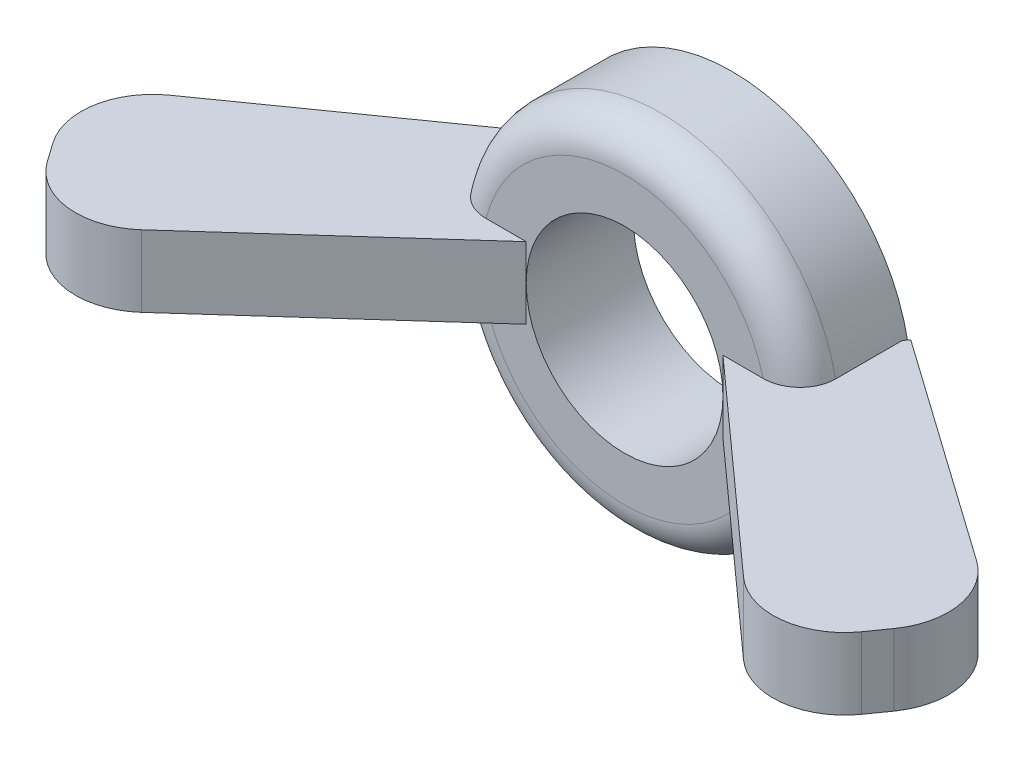
ISO-10303-21;
HEADER;
FILE_DESCRIPTION(('STEP AP214'),'2;1');
FILE_NAME('part.step','',(''),(''),'','','');
FILE_SCHEMA(('AUTOMOTIVE_DESIGN { 1 0 10303 214 1 1 1 1 }'));
ENDSEC;
DATA;
#1=APPLICATION_CONTEXT('core data for automotive mechanical design processes');
#2=APPLICATION_PROTOCOL_DEFINITION('international standard','automotive_design',2000,#1);
#3=PRODUCT_CONTEXT('',#1,'mechanical');
#4=PRODUCT('Part','Part','',(#3));
#5=PRODUCT_RELATED_PRODUCT_CATEGORY('part','',(#4));
#6=PRODUCT_DEFINITION_FORMATION('','',#4);
#7=PRODUCT_DEFINITION_CONTEXT('part definition',#1,'design');
#8=PRODUCT_DEFINITION('design','',#6,#7);
#9=PRODUCT_DEFINITION_SHAPE('','',#8);
#10=(LENGTH_UNIT() NAMED_UNIT(*) SI_UNIT(.MILLI.,.METRE.));
#11=(NAMED_UNIT(*) PLANE_ANGLE_UNIT() SI_UNIT($,.RADIAN.));
#12=(NAMED_UNIT(*) SI_UNIT($,.STERADIAN.) SOLID_ANGLE_UNIT());
#13=UNCERTAINTY_MEASURE_WITH_UNIT(LENGTH_MEASURE(1.E-05),#10,'distance_accuracy_value','');
#14=(GEOMETRIC_REPRESENTATION_CONTEXT(3) GLOBAL_UNCERTAINTY_ASSIGNED_CONTEXT((#13)) GLOBAL_UNIT_ASSIGNED_CONTEXT((#10,
#11,#12)) REPRESENTATION_CONTEXT('',''));
#15=CARTESIAN_POINT('',(0.,0.,0.));
#16=DIRECTION('',(0.,0.,1.));
#17=DIRECTION('',(1.,0.,0.));
#18=AXIS2_PLACEMENT_3D('',#15,#16,#17);
#19=CARTESIAN_POINT('',(0.,0.,3.));
#20=DIRECTION('',(0.,0.,1.));
#21=DIRECTION('',(1.,0.,0.));
#22=AXIS2_PLACEMENT_3D('',#19,#20,#21);
#23=PLANE('',#22);
#24=DIRECTION('',(-1.,0.,0.));
#25=VECTOR('',#24,1.);
#26=CARTESIAN_POINT('',(0.,-1.,3.));
#27=LINE('',#26,#25);
#28=CARTESIAN_POINT('',(-2.75,-1.,3.));
#29=VERTEX_POINT('',#28);
#30=CARTESIAN_POINT('',(-3.87298334620742,-1.,3.));
#31=VERTEX_POINT('',#30);
#32=EDGE_CURVE('E302',#29,#31,#27,.T.);
#33=ORIENTED_EDGE('',*,*,#32,.T.);
#34=CARTESIAN_POINT('',(0.,0.,3.));
#35=DIRECTION('',(0.,0.,1.));
#36=DIRECTION('',(1.,0.,0.));
#37=AXIS2_PLACEMENT_3D('',#34,#35,#36);
#38=CIRCLE('',#37,4.);
#39=CARTESIAN_POINT('',(3.87298334620742,-1.,3.));
#40=VERTEX_POINT('',#39);
#41=EDGE_CURVE('E331',#31,#40,#38,.T.);
#42=ORIENTED_EDGE('',*,*,#41,.T.);
#43=DIRECTION('',(1.,0.,0.));
#44=VECTOR('',#43,1.);
#45=CARTESIAN_POINT('',(0.,-1.,3.));
#46=LINE('',#45,#44);
#47=CARTESIAN_POINT('',(2.75,-1.,3.));
#48=VERTEX_POINT('',#47);
#49=EDGE_CURVE('E243',#48,#40,#46,.T.);
#50=ORIENTED_EDGE('',*,*,#49,.F.);
#51=DIRECTION('',(0.,1.,0.));
#52=VECTOR('',#51,1.);
#53=CARTESIAN_POINT('',(2.75,-1.,3.));
#54=LINE('',#53,#52);
#55=CARTESIAN_POINT('',(2.75,0.,3.));
#56=VERTEX_POINT('',#55);
#57=EDGE_CURVE('E228',#48,#56,#54,.T.);
#58=ORIENTED_EDGE('',*,*,#57,.T.);
#59=CARTESIAN_POINT('',(0.,0.,3.));
#60=DIRECTION('',(0.,0.,1.));
#61=DIRECTION('',(1.,0.,0.));
#62=AXIS2_PLACEMENT_3D('',#59,#60,#61);
#63=CIRCLE('',#62,2.75);
#64=CARTESIAN_POINT('',(-2.75,0.,3.));
#65=VERTEX_POINT('',#64);
#66=EDGE_CURVE('E306',#65,#56,#63,.T.);
#67=ORIENTED_EDGE('',*,*,#66,.F.);
#68=DIRECTION('',(0.,1.,0.));
#69=VECTOR('',#68,1.);
#70=CARTESIAN_POINT('',(-2.75,-1.,3.));
#71=LINE('',#70,#69);
#72=EDGE_CURVE('E280',#29,#65,#71,.T.);
#73=ORIENTED_EDGE('',*,*,#72,.F.);
#74=EDGE_LOOP('',(#33,#42,#50,#58,#67,#73));
#75=FACE_BOUND('',#74,.T.);
#76=ADVANCED_FACE('F33',(#75),#23,.T.);
#77=CARTESIAN_POINT('',(0.,0.,3.));
#78=DIRECTION('',(0.,0.,-1.));
#79=DIRECTION('',(-1.,0.,0.));
#80=AXIS2_PLACEMENT_3D('',#77,#78,#79);
#81=CYLINDRICAL_SURFACE('',#80,5.);
#82=DIRECTION('',(0.,0.,-1.));
#83=VECTOR('',#82,1.);
#84=CARTESIAN_POINT('',(4.89897948556636,-1.,3.));
#85=LINE('',#84,#83);
#86=CARTESIAN_POINT('',(4.89897948556635,-1.,0.13469401924486));
#87=VERTEX_POINT('',#86);
#88=CARTESIAN_POINT('',(4.89897948556636,-1.,2.));
#89=VERTEX_POINT('',#88);
#90=EDGE_CURVE('E324',#87,#89,#85,.F.);
#91=ORIENTED_EDGE('',*,*,#90,.T.);
#92=CARTESIAN_POINT('',(0.,0.,2.));
#93=DIRECTION('',(0.,0.,1.));
#94=DIRECTION('',(1.,0.,0.));
#95=AXIS2_PLACEMENT_3D('',#92,#93,#94);
#96=CIRCLE('',#95,5.);
#97=CARTESIAN_POINT('',(-4.89897948556636,-1.,2.));
#98=VERTEX_POINT('',#97);
#99=EDGE_CURVE('E53',#89,#98,#96,.F.);
#100=ORIENTED_EDGE('',*,*,#99,.T.);
#101=DIRECTION('',(0.,0.,-1.));
#102=VECTOR('',#101,1.);
#103=CARTESIAN_POINT('',(-4.89897948556636,-1.,3.));
#104=LINE('',#103,#102);
#105=CARTESIAN_POINT('',(-4.89897948556636,-1.,0.134694019244858));
#106=VERTEX_POINT('',#105);
#107=EDGE_CURVE('E319',#106,#98,#104,.F.);
#108=ORIENTED_EDGE('',*,*,#107,.F.);
#109=CARTESIAN_POINT('',(0.,0.,6.66666666666667));
#110=DIRECTION('',(0.8,0.,-0.6));
#111=DIRECTION('',(-0.6,0.,-0.8));
#112=AXIS2_PLACEMENT_3D('',#109,#110,#111);
#113=ELLIPSE('',#112,8.33333333333333,5.);
#114=CARTESIAN_POINT('',(-5.,0.,0.));
#115=VERTEX_POINT('',#114);
#116=EDGE_CURVE('E283',#106,#115,#113,.T.);
#117=ORIENTED_EDGE('',*,*,#116,.T.);
#118=CARTESIAN_POINT('',(0.,0.,0.));
#119=DIRECTION('',(0.,0.,1.));
#120=DIRECTION('',(1.,0.,0.));
#121=AXIS2_PLACEMENT_3D('',#118,#119,#120);
#122=CIRCLE('',#121,5.);
#123=CARTESIAN_POINT('',(5.,0.,0.));
#124=VERTEX_POINT('',#123);
#125=EDGE_CURVE('E313',#115,#124,#122,.T.);
#126=ORIENTED_EDGE('',*,*,#125,.T.);
#127=CARTESIAN_POINT('',(0.,0.,6.66666666666667));
#128=DIRECTION('',(-0.8,0.,-0.6));
#129=DIRECTION('',(0.6,0.,-0.8));
#130=AXIS2_PLACEMENT_3D('',#127,#128,#129);
#131=ELLIPSE('',#130,8.33333333333333,5.);
#132=EDGE_CURVE('E239',#124,#87,#131,.T.);
#133=ORIENTED_EDGE('',*,*,#132,.T.);
#134=EDGE_LOOP('',(#91,#100,#108,#117,#126,#133));
#135=FACE_BOUND('',#134,.T.);
#136=ADVANCED_FACE('F395',(#135),#81,.T.);
#137=DIRECTION('',(1.,0.,0.));
#138=VECTOR('',#137,1.);
#139=CARTESIAN_POINT('',(0.,1.,3.));
#140=LINE('',#139,#138);
#141=CARTESIAN_POINT('',(2.75,1.,3.));
#142=VERTEX_POINT('',#141);
#143=CARTESIAN_POINT('',(3.87298334620742,1.,3.));
#144=VERTEX_POINT('',#143);
#145=EDGE_CURVE('E240',#142,#144,#140,.T.);
#146=ORIENTED_EDGE('',*,*,#145,.T.);
#147=CARTESIAN_POINT('',(0.,0.,3.));
#148=DIRECTION('',(0.,0.,1.));
#149=DIRECTION('',(1.,0.,0.));
#150=AXIS2_PLACEMENT_3D('',#147,#148,#149);
#151=CIRCLE('',#150,4.);
#152=CARTESIAN_POINT('',(-3.87298334620742,1.,3.));
#153=VERTEX_POINT('',#152);
#154=EDGE_CURVE('E326',#144,#153,#151,.T.);
#155=ORIENTED_EDGE('',*,*,#154,.T.);
#156=DIRECTION('',(-1.,0.,0.));
#157=VECTOR('',#156,1.);
#158=CARTESIAN_POINT('',(0.,1.,3.));
#159=LINE('',#158,#157);
#160=CARTESIAN_POINT('',(-2.75,1.,3.));
#161=VERTEX_POINT('',#160);
#162=EDGE_CURVE('E299',#161,#153,#159,.T.);
#163=ORIENTED_EDGE('',*,*,#162,.F.);
#164=EDGE_CURVE('E284',#65,#161,#71,.T.);
#165=ORIENTED_EDGE('',*,*,#164,.F.);
#166=EDGE_CURVE('E310',#56,#65,#63,.T.);
#167=ORIENTED_EDGE('',*,*,#166,.F.);
#168=EDGE_CURVE('E230',#56,#142,#54,.T.);
#169=ORIENTED_EDGE('',*,*,#168,.T.);
#170=EDGE_LOOP('',(#146,#155,#163,#165,#167,#169));
#171=FACE_BOUND('',#170,.T.);
#172=ADVANCED_FACE('F391',(#171),#23,.T.);
#173=DIRECTION('',(0.,0.,-1.));
#174=VECTOR('',#173,1.);
#175=CARTESIAN_POINT('',(-4.89897948556636,1.,3.));
#176=LINE('',#175,#174);
#177=CARTESIAN_POINT('',(-4.89897948556636,1.,0.134694019244858));
#178=VERTEX_POINT('',#177);
#179=CARTESIAN_POINT('',(-4.89897948556636,1.,2.));
#180=VERTEX_POINT('',#179);
#181=EDGE_CURVE('E316',#178,#180,#176,.F.);
#182=ORIENTED_EDGE('',*,*,#181,.T.);
#183=CARTESIAN_POINT('',(0.,0.,2.));
#184=DIRECTION('',(0.,0.,1.));
#185=DIRECTION('',(1.,0.,0.));
#186=AXIS2_PLACEMENT_3D('',#183,#184,#185);
#187=CIRCLE('',#186,5.);
#188=CARTESIAN_POINT('',(4.89897948556636,1.,2.));
#189=VERTEX_POINT('',#188);
#190=EDGE_CURVE('E329',#180,#189,#187,.F.);
#191=ORIENTED_EDGE('',*,*,#190,.T.);
#192=DIRECTION('',(0.,0.,-1.));
#193=VECTOR('',#192,1.);
#194=CARTESIAN_POINT('',(4.89897948556636,1.,3.));
#195=LINE('',#194,#193);
#196=CARTESIAN_POINT('',(4.89897948556636,1.,0.134694019244858));
#197=VERTEX_POINT('',#196);
#198=EDGE_CURVE('E321',#197,#189,#195,.F.);
#199=ORIENTED_EDGE('',*,*,#198,.F.);
#200=EDGE_CURVE('E227',#197,#124,#131,.T.);
#201=ORIENTED_EDGE('',*,*,#200,.T.);
#202=EDGE_CURVE('E309',#124,#115,#122,.T.);
#203=ORIENTED_EDGE('',*,*,#202,.T.);
#204=EDGE_CURVE('E298',#115,#178,#113,.T.);
#205=ORIENTED_EDGE('',*,*,#204,.T.);
#206=EDGE_LOOP('',(#182,#191,#199,#201,#203,#205));
#207=FACE_BOUND('',#206,.T.);
#208=ADVANCED_FACE('F394',(#207),#81,.T.);
#209=CARTESIAN_POINT('',(0.,0.,0.));
#210=DIRECTION('',(0.,0.,1.));
#211=DIRECTION('',(1.,0.,0.));
#212=AXIS2_PLACEMENT_3D('',#209,#210,#211);
#213=PLANE('',#212);
#214=ORIENTED_EDGE('',*,*,#125,.F.);
#215=ORIENTED_EDGE('',*,*,#202,.F.);
#216=EDGE_LOOP('',(#214,#215));
#217=FACE_BOUND('',#216,.T.);
#218=CARTESIAN_POINT('',(0.,0.,0.));
#219=DIRECTION('',(0.,0.,1.));
#220=DIRECTION('',(1.,0.,0.));
#221=AXIS2_PLACEMENT_3D('',#218,#219,#220);
#222=CIRCLE('',#221,2.75);
#223=CARTESIAN_POINT('',(2.75,0.,0.));
#224=VERTEX_POINT('',#223);
#225=EDGE_CURVE('E305',#224,#224,#222,.T.);
#226=ORIENTED_EDGE('',*,*,#225,.T.);
#227=EDGE_LOOP('',(#226));
#228=FACE_BOUND('',#227,.T.);
#229=ADVANCED_FACE('F389',(#217,#228),#213,.F.);
#230=CARTESIAN_POINT('',(0.,0.,3.));
#231=DIRECTION('',(0.,0.,-1.));
#232=DIRECTION('',(-1.,0.,0.));
#233=AXIS2_PLACEMENT_3D('',#230,#231,#232);
#234=CYLINDRICAL_SURFACE('',#233,2.75);
#235=ORIENTED_EDGE('',*,*,#66,.T.);
#236=ORIENTED_EDGE('',*,*,#166,.T.);
#237=EDGE_LOOP('',(#235,#236));
#238=FACE_BOUND('',#237,.T.);
#239=ORIENTED_EDGE('',*,*,#225,.F.);
#240=EDGE_LOOP('',(#239));
#241=FACE_BOUND('',#240,.T.);
#242=ADVANCED_FACE('F385',(#238,#241),#234,.F.);
#243=CARTESIAN_POINT('',(-5.,-1.,0.));
#244=DIRECTION('',(0.8,0.,-0.6));
#245=DIRECTION('',(-0.6,0.,-0.8));
#246=AXIS2_PLACEMENT_3D('',#243,#244,#245);
#247=PLANE('',#246);
#248=ORIENTED_EDGE('',*,*,#204,.F.);
#249=DIRECTION('',(0.,1.,0.));
#250=VECTOR('',#249,1.);
#251=CARTESIAN_POINT('',(-5.,-1.,0.));
#252=LINE('',#251,#250);
#253=CARTESIAN_POINT('',(-5.,1.,0.));
#254=VERTEX_POINT('',#253);
#255=EDGE_CURVE('E279',#115,#254,#252,.T.);
#256=ORIENTED_EDGE('',*,*,#255,.T.);
#257=DIRECTION('',(-0.6,0.,-0.8));
#258=VECTOR('',#257,1.);
#259=CARTESIAN_POINT('',(-5.,1.,0.));
#260=LINE('',#259,#258);
#261=EDGE_CURVE('E245',#178,#254,#260,.T.);
#262=ORIENTED_EDGE('',*,*,#261,.F.);
#263=EDGE_LOOP('',(#248,#256,#262));
#264=FACE_BOUND('',#263,.T.);
#265=ADVANCED_FACE('F382',(#264),#247,.T.);
#266=ORIENTED_EDGE('',*,*,#116,.F.);
#267=DIRECTION('',(-0.6,0.,-0.8));
#268=VECTOR('',#267,1.);
#269=CARTESIAN_POINT('',(-5.,-1.,0.));
#270=LINE('',#269,#268);
#271=CARTESIAN_POINT('',(-5.,-1.,0.));
#272=VERTEX_POINT('',#271);
#273=EDGE_CURVE('E262',#106,#272,#270,.T.);
#274=ORIENTED_EDGE('',*,*,#273,.T.);
#275=EDGE_CURVE('E293',#272,#115,#252,.T.);
#276=ORIENTED_EDGE('',*,*,#275,.T.);
#277=EDGE_LOOP('',(#266,#274,#276));
#278=FACE_BOUND('',#277,.T.);
#279=ADVANCED_FACE('F366',(#278),#247,.T.);
#280=CARTESIAN_POINT('',(-8.41291055013189,-1.,8.08746087611477));
#281=DIRECTION('',(0.668299770310106,0.,0.743892073491484));
#282=DIRECTION('',(0.743892073491484,0.,-0.668299770310106));
#283=AXIS2_PLACEMENT_3D('',#280,#281,#282);
#284=PLANE('',#283);
#285=ORIENTED_EDGE('',*,*,#72,.T.);
#286=ORIENTED_EDGE('',*,*,#164,.T.);
#287=DIRECTION('',(0.743892073491484,0.,-0.668299770310106));
#288=VECTOR('',#287,1.);
#289=CARTESIAN_POINT('',(-8.41291055013189,1.,8.08746087611477));
#290=LINE('',#289,#288);
#291=CARTESIAN_POINT('',(-8.41291055013189,1.,8.08746087611477));
#292=VERTEX_POINT('',#291);
#293=EDGE_CURVE('E259',#292,#161,#290,.T.);
#294=ORIENTED_EDGE('',*,*,#293,.F.);
#295=DIRECTION('',(0.,1.,0.));
#296=VECTOR('',#295,1.);
#297=CARTESIAN_POINT('',(-8.41291055013189,-1.,8.08746087611477));
#298=LINE('',#297,#296);
#299=CARTESIAN_POINT('',(-8.41291055013189,-1.,8.08746087611477));
#300=VERTEX_POINT('',#299);
#301=EDGE_CURVE('E285',#300,#292,#298,.T.);
#302=ORIENTED_EDGE('',*,*,#301,.F.);
#303=DIRECTION('',(0.743892073491484,0.,-0.668299770310106));
#304=VECTOR('',#303,1.);
#305=CARTESIAN_POINT('',(-8.41291055013189,-1.,8.08746087611477));
#306=LINE('',#305,#304);
#307=EDGE_CURVE('E276',#300,#29,#306,.T.);
#308=ORIENTED_EDGE('',*,*,#307,.T.);
#309=EDGE_LOOP('',(#285,#286,#294,#302,#308));
#310=FACE_BOUND('',#309,.T.);
#311=ADVANCED_FACE('F362',(#310),#284,.T.);
#312=CARTESIAN_POINT('',(-9.7495100907521,-1.,6.5996767291318));
#313=DIRECTION('',(0.,1.,0.));
#314=DIRECTION('',(0.,0.,1.));
#315=AXIS2_PLACEMENT_3D('',#312,#313,#314);
#316=CYLINDRICAL_SURFACE('',#315,2.);
#317=ORIENTED_EDGE('',*,*,#301,.T.);
#318=CARTESIAN_POINT('',(-9.7495100907521,1.,6.5996767291318));
#319=DIRECTION('',(0.,1.,0.));
#320=DIRECTION('',(0.,0.,1.));
#321=AXIS2_PLACEMENT_3D('',#318,#319,#320);
#322=CIRCLE('',#321,2.);
#323=CARTESIAN_POINT('',(-11.3829267537404,1.,7.75377811335772));
#324=VERTEX_POINT('',#323);
#325=EDGE_CURVE('E256',#324,#292,#322,.T.);
#326=ORIENTED_EDGE('',*,*,#325,.F.);
#327=DIRECTION('',(0.,1.,0.));
#328=VECTOR('',#327,1.);
#329=CARTESIAN_POINT('',(-11.3829267537404,-1.,7.75377811335772));
#330=LINE('',#329,#328);
#331=CARTESIAN_POINT('',(-11.3829267537404,-1.,7.75377811335772));
#332=VERTEX_POINT('',#331);
#333=EDGE_CURVE('E287',#332,#324,#330,.T.);
#334=ORIENTED_EDGE('',*,*,#333,.F.);
#335=CARTESIAN_POINT('',(-9.7495100907521,-1.,6.5996767291318));
#336=DIRECTION('',(0.,1.,0.));
#337=DIRECTION('',(0.,0.,1.));
#338=AXIS2_PLACEMENT_3D('',#335,#336,#337);
#339=CIRCLE('',#338,2.);
#340=EDGE_CURVE('E273',#332,#300,#339,.T.);
#341=ORIENTED_EDGE('',*,*,#340,.T.);
#342=EDGE_LOOP('',(#317,#326,#334,#341));
#343=FACE_BOUND('',#342,.T.);
#344=ADVANCED_FACE('F365',(#343),#316,.T.);
#345=CARTESIAN_POINT('',(-11.7576074327959,-1.,7.22348703769145));
#346=DIRECTION('',(-0.816708331494145,0.,0.577050692112963));
#347=DIRECTION('',(0.577050692112963,0.,0.816708331494145));
#348=AXIS2_PLACEMENT_3D('',#345,#346,#347);
#349=PLANE('',#348);
#350=ORIENTED_EDGE('',*,*,#333,.T.);
#351=DIRECTION('',(0.577050692112963,0.,0.816708331494145));
#352=VECTOR('',#351,1.);
#353=CARTESIAN_POINT('',(-11.7576074327959,1.,7.22348703769145));
#354=LINE('',#353,#352);
#355=CARTESIAN_POINT('',(-11.7576074327959,1.,7.22348703769145));
#356=VERTEX_POINT('',#355);
#357=EDGE_CURVE('E253',#356,#324,#354,.T.);
#358=ORIENTED_EDGE('',*,*,#357,.F.);
#359=DIRECTION('',(0.,1.,0.));
#360=VECTOR('',#359,1.);
#361=CARTESIAN_POINT('',(-11.7576074327959,-1.,7.22348703769145));
#362=LINE('',#361,#360);
#363=CARTESIAN_POINT('',(-11.7576074327959,-1.,7.22348703769145));
#364=VERTEX_POINT('',#363);
#365=EDGE_CURVE('E289',#364,#356,#362,.T.);
#366=ORIENTED_EDGE('',*,*,#365,.F.);
#367=DIRECTION('',(0.577050692112963,0.,0.816708331494145));
#368=VECTOR('',#367,1.);
#369=CARTESIAN_POINT('',(-11.7576074327959,-1.,7.22348703769145));
#370=LINE('',#369,#368);
#371=EDGE_CURVE('E270',#364,#332,#370,.T.);
#372=ORIENTED_EDGE('',*,*,#371,.T.);
#373=EDGE_LOOP('',(#350,#358,#366,#372));
#374=FACE_BOUND('',#373,.T.);
#375=ADVANCED_FACE('F370',(#374),#349,.T.);
#376=CARTESIAN_POINT('',(-10.1241907698076,-1.,6.06938565346553));
#377=DIRECTION('',(0.,1.,0.));
#378=DIRECTION('',(0.,0.,1.));
#379=AXIS2_PLACEMENT_3D('',#376,#377,#378);
#380=CYLINDRICAL_SURFACE('',#379,2.);
#381=ORIENTED_EDGE('',*,*,#365,.T.);
#382=CARTESIAN_POINT('',(-10.1241907698076,1.,6.06938565346553));
#383=DIRECTION('',(0.,1.,0.));
#384=DIRECTION('',(0.,0.,1.));
#385=AXIS2_PLACEMENT_3D('',#382,#383,#384);
#386=CIRCLE('',#385,2.);
#387=CARTESIAN_POINT('',(-11.2782921540336,1.,4.43596899047724));
#388=VERTEX_POINT('',#387);
#389=EDGE_CURVE('E250',#388,#356,#386,.T.);
#390=ORIENTED_EDGE('',*,*,#389,.F.);
#391=DIRECTION('',(0.,1.,0.));
#392=VECTOR('',#391,1.);
#393=CARTESIAN_POINT('',(-11.2782921540336,-1.,4.43596899047724));
#394=LINE('',#393,#392);
#395=CARTESIAN_POINT('',(-11.2782921540336,-1.,4.43596899047724));
#396=VERTEX_POINT('',#395);
#397=EDGE_CURVE('E291',#396,#388,#394,.T.);
#398=ORIENTED_EDGE('',*,*,#397,.F.);
#399=CARTESIAN_POINT('',(-10.1241907698076,-1.,6.06938565346553));
#400=DIRECTION('',(0.,1.,0.));
#401=DIRECTION('',(0.,0.,1.));
#402=AXIS2_PLACEMENT_3D('',#399,#400,#401);
#403=CIRCLE('',#402,2.);
#404=EDGE_CURVE('E267',#396,#364,#403,.T.);
#405=ORIENTED_EDGE('',*,*,#404,.T.);
#406=EDGE_LOOP('',(#381,#390,#398,#405));
#407=FACE_BOUND('',#406,.T.);
#408=ADVANCED_FACE('F374',(#407),#380,.T.);
#409=CARTESIAN_POINT('',(-5.,-1.,0.));
#410=DIRECTION('',(-0.577050692112961,0.,-0.816708331494147));
#411=DIRECTION('',(-0.816708331494147,0.,0.577050692112961));
#412=AXIS2_PLACEMENT_3D('',#409,#410,#411);
#413=PLANE('',#412);
#414=ORIENTED_EDGE('',*,*,#397,.T.);
#415=DIRECTION('',(-0.816708331494147,0.,0.577050692112961));
#416=VECTOR('',#415,1.);
#417=CARTESIAN_POINT('',(-5.,1.,0.));
#418=LINE('',#417,#416);
#419=EDGE_CURVE('E247',#254,#388,#418,.T.);
#420=ORIENTED_EDGE('',*,*,#419,.F.);
#421=ORIENTED_EDGE('',*,*,#255,.F.);
#422=ORIENTED_EDGE('',*,*,#275,.F.);
#423=DIRECTION('',(-0.816708331494147,0.,0.577050692112961));
#424=VECTOR('',#423,1.);
#425=CARTESIAN_POINT('',(-5.,-1.,0.));
#426=LINE('',#425,#424);
#427=EDGE_CURVE('E264',#272,#396,#426,.T.);
#428=ORIENTED_EDGE('',*,*,#427,.T.);
#429=EDGE_LOOP('',(#414,#420,#421,#422,#428));
#430=FACE_BOUND('',#429,.T.);
#431=ADVANCED_FACE('F360',(#430),#413,.T.);
#432=CARTESIAN_POINT('',(-9.7495100907521,-1.,6.5996767291318));
#433=DIRECTION('',(0.,1.,0.));
#434=DIRECTION('',(0.,0.,1.));
#435=AXIS2_PLACEMENT_3D('',#432,#433,#434);
#436=PLANE('',#435);
#437=ORIENTED_EDGE('',*,*,#32,.F.);
#438=ORIENTED_EDGE('',*,*,#307,.F.);
#439=ORIENTED_EDGE('',*,*,#340,.F.);
#440=ORIENTED_EDGE('',*,*,#371,.F.);
#441=ORIENTED_EDGE('',*,*,#404,.F.);
#442=ORIENTED_EDGE('',*,*,#427,.F.);
#443=ORIENTED_EDGE('',*,*,#273,.F.);
#444=ORIENTED_EDGE('',*,*,#107,.T.);
#445=CARTESIAN_POINT('',(-4.89897948556636,-1.,2.));
#446=CARTESIAN_POINT('',(-4.89897953769252,-1.,2.02769671046722));
#447=CARTESIAN_POINT('',(-4.89780433750787,-1.,2.05538003328283));
#448=CARTESIAN_POINT('',(-4.89311761693166,-1.,2.11054593320961));
#449=CARTESIAN_POINT('',(-4.88960628577636,-1.,2.13802852639842));
#450=CARTESIAN_POINT('',(-4.87560908157791,-1.,2.2198042007192));
#451=CARTESIAN_POINT('',(-4.86165985616151,-1.,2.2735451865649));
#452=CARTESIAN_POINT('',(-4.82495038442105,-1.,2.37791372215591));
#453=CARTESIAN_POINT('',(-4.80218733714401,-1.,2.42854027622993));
#454=CARTESIAN_POINT('',(-4.74854706497202,-1.,2.52529559316128));
#455=CARTESIAN_POINT('',(-4.71767015424067,-1.,2.57142453006868));
#456=CARTESIAN_POINT('',(-4.64846379058115,-1.,2.65827442333467));
#457=CARTESIAN_POINT('',(-4.61007951794842,-1.,2.6989516462707));
#458=CARTESIAN_POINT('',(-4.52713683011098,-1.,2.77343679547463));
#459=CARTESIAN_POINT('',(-4.48257729892751,-1.,2.80724347738404));
#460=CARTESIAN_POINT('',(-4.38764424072155,-1.,2.86774033938808));
#461=CARTESIAN_POINT('',(-4.33717448507534,-1.,2.89427930737229));
#462=CARTESIAN_POINT('',(-4.23257257993109,-1.,2.93873696583397));
#463=CARTESIAN_POINT('',(-4.17844089274068,-1.,2.95665674214998));
#464=CARTESIAN_POINT('',(-4.08228944581671,-1.,2.98004418450993));
#465=CARTESIAN_POINT('',(-4.04074746508235,-1.,2.98753156842478));
#466=CARTESIAN_POINT('',(-3.95713442986744,-1.,2.99750939937191));
#467=CARTESIAN_POINT('',(-3.91506432578064,-1.,3.00000780376358));
#468=CARTESIAN_POINT('',(-3.87298334620742,-1.,3.));
#469=B_SPLINE_CURVE_WITH_KNOTS('',3,(#445,#446,#447,#448,#449,#450,#451,#452,#453,#454,#455,
#456,#457,#458,#459,#460,#461,#462,#463,#464,#465,#466,#467,#468),.UNSPECIFIED.,.F.,.F.,(4,2,2,
2,2,2,2,2,2,2,2,4),(0.,0.0830386808123157,0.166070635967418,0.331779135941515,0.4975403398586,
0.663295126553686,0.830308791210176,0.997352677652824,1.16764570632508,1.3379172760016,
1.46426486625696,1.59041077221889),.UNSPECIFIED.);
#470=EDGE_CURVE('E11',#98,#31,#469,.T.);
#471=ORIENTED_EDGE('',*,*,#470,.T.);
#472=EDGE_LOOP('',(#437,#438,#439,#440,#441,#442,#443,#444,#471));
#473=FACE_BOUND('',#472,.T.);
#474=ADVANCED_FACE('F354',(#473),#436,.F.);
#475=CARTESIAN_POINT('',(-9.7495100907521,1.,6.5996767291318));
#476=DIRECTION('',(0.,1.,0.));
#477=DIRECTION('',(0.,0.,1.));
#478=AXIS2_PLACEMENT_3D('',#475,#476,#477);
#479=PLANE('',#478);
#480=ORIENTED_EDGE('',*,*,#293,.T.);
#481=ORIENTED_EDGE('',*,*,#162,.T.);
#482=CARTESIAN_POINT('',(-3.87298334620742,1.,3.));
#483=CARTESIAN_POINT('',(-3.90248046424841,1.,2.9999994274582));
#484=CARTESIAN_POINT('',(-3.93196440432356,1.,2.99877566262111));
#485=CARTESIAN_POINT('',(-3.99073029101351,1.,2.99388044653298));
#486=CARTESIAN_POINT('',(-4.02001222299989,1.,2.99020881986111));
#487=CARTESIAN_POINT('',(-4.10725065429741,1.,2.97552626350704));
#488=CARTESIAN_POINT('',(-4.16463519401809,1.,2.96084765796537));
#489=CARTESIAN_POINT('',(-4.27613653028676,1.,2.92198926371139));
#490=CARTESIAN_POINT('',(-4.33024977421371,1.,2.89779935225144));
#491=CARTESIAN_POINT('',(-4.43351548278463,1.,2.84050968568627));
#492=CARTESIAN_POINT('',(-4.48267065475829,1.,2.80741482968905));
#493=CARTESIAN_POINT('',(-4.57360186677932,1.,2.73391226460698));
#494=CARTESIAN_POINT('',(-4.61550221619383,1.,2.69365833768063));
#495=CARTESIAN_POINT('',(-4.69175485394343,1.,2.60651728967209));
#496=CARTESIAN_POINT('',(-4.72610583481488,1.,2.55962902190629));
#497=CARTESIAN_POINT('',(-4.78539895911501,1.,2.46179838009332));
#498=CARTESIAN_POINT('',(-4.81054873902346,1.,2.41098162398401));
#499=CARTESIAN_POINT('',(-4.85177069043608,1.,2.30581322741058));
#500=CARTESIAN_POINT('',(-4.86785111158046,1.,2.25146484972584));
#501=CARTESIAN_POINT('',(-4.88573983881054,1.,2.16389806882584));
#502=CARTESIAN_POINT('',(-4.89070243324983,1.,2.13129226806736));
#503=CARTESIAN_POINT('',(-4.89732095042909,1.,2.06579613663552));
#504=CARTESIAN_POINT('',(-4.89898180786745,1.,2.03290630447792));
#505=CARTESIAN_POINT('',(-4.89897948556636,1.,2.));
#506=B_SPLINE_CURVE_WITH_KNOTS('',3,(#482,#483,#484,#485,#486,#487,#488,#489,#490,#491,#492,
#493,#494,#495,#496,#497,#498,#499,#500,#501,#502,#503,#504,#505),.UNSPECIFIED.,.F.,.F.,(4,2,2,
2,2,2,2,2,2,2,2,4),(0.,0.0884392063282547,0.176884751146111,0.353670951622964,0.530645814648994,
0.707523512277266,0.880980952542802,1.05446841000635,1.22375612891884,1.39288961151274,
1.49168211385747,1.59032685191303),.UNSPECIFIED.);
#507=EDGE_CURVE('E335',#153,#180,#506,.T.);
#508=ORIENTED_EDGE('',*,*,#507,.T.);
#509=ORIENTED_EDGE('',*,*,#181,.F.);
#510=ORIENTED_EDGE('',*,*,#261,.T.);
#511=ORIENTED_EDGE('',*,*,#419,.T.);
#512=ORIENTED_EDGE('',*,*,#389,.T.);
#513=ORIENTED_EDGE('',*,*,#357,.T.);
#514=ORIENTED_EDGE('',*,*,#325,.T.);
#515=EDGE_LOOP('',(#480,#481,#508,#509,#510,#511,#512,#513,#514));
#516=FACE_BOUND('',#515,.T.);
#517=ADVANCED_FACE('F349',(#516),#479,.T.);
#518=CARTESIAN_POINT('',(5.,-1.,0.));
#519=DIRECTION('',(-0.8,0.,-0.6));
#520=DIRECTION('',(-0.6,0.,0.8));
#521=AXIS2_PLACEMENT_3D('',#518,#519,#520);
#522=PLANE('',#521);
#523=ORIENTED_EDGE('',*,*,#132,.F.);
#524=DIRECTION('',(0.,1.,0.));
#525=VECTOR('',#524,1.);
#526=CARTESIAN_POINT('',(5.,-1.,0.));
#527=LINE('',#526,#525);
#528=CARTESIAN_POINT('',(5.,-1.,0.));
#529=VERTEX_POINT('',#528);
#530=EDGE_CURVE('E231',#529,#124,#527,.T.);
#531=ORIENTED_EDGE('',*,*,#530,.F.);
#532=DIRECTION('',(-0.6,0.,0.8));
#533=VECTOR('',#532,1.);
#534=CARTESIAN_POINT('',(5.,-1.,0.));
#535=LINE('',#534,#533);
#536=EDGE_CURVE('E220',#529,#87,#535,.T.);
#537=ORIENTED_EDGE('',*,*,#536,.T.);
#538=EDGE_LOOP('',(#523,#531,#537));
#539=FACE_BOUND('',#538,.T.);
#540=ADVANCED_FACE('F353',(#539),#522,.T.);
#541=ORIENTED_EDGE('',*,*,#200,.F.);
#542=DIRECTION('',(-0.6,0.,0.8));
#543=VECTOR('',#542,1.);
#544=CARTESIAN_POINT('',(5.,1.,0.));
#545=LINE('',#544,#543);
#546=CARTESIAN_POINT('',(5.,1.,0.));
#547=VERTEX_POINT('',#546);
#548=EDGE_CURVE('E207',#547,#197,#545,.T.);
#549=ORIENTED_EDGE('',*,*,#548,.F.);
#550=EDGE_CURVE('E234',#124,#547,#527,.T.);
#551=ORIENTED_EDGE('',*,*,#550,.F.);
#552=EDGE_LOOP('',(#541,#549,#551));
#553=FACE_BOUND('',#552,.T.);
#554=ADVANCED_FACE('F430',(#553),#522,.T.);
#555=CARTESIAN_POINT('',(9.7495100907521,-1.,6.5996767291318));
#556=DIRECTION('',(0.,1.,0.));
#557=DIRECTION('',(0.,0.,1.));
#558=AXIS2_PLACEMENT_3D('',#555,#556,#557);
#559=CYLINDRICAL_SURFACE('',#558,2.);
#560=DIRECTION('',(0.,1.,0.));
#561=VECTOR('',#560,1.);
#562=CARTESIAN_POINT('',(11.3829267537404,-1.,7.75377811335772));
#563=LINE('',#562,#561);
#564=CARTESIAN_POINT('',(11.3829267537404,-1.,7.75377811335772));
#565=VERTEX_POINT('',#564);
#566=CARTESIAN_POINT('',(11.3829267537404,1.,7.75377811335772));
#567=VERTEX_POINT('',#566);
#568=EDGE_CURVE('E175',#565,#567,#563,.T.);
#569=ORIENTED_EDGE('',*,*,#568,.T.);
#570=CARTESIAN_POINT('',(9.7495100907521,1.,6.5996767291318));
#571=DIRECTION('',(0.,1.,0.));
#572=DIRECTION('',(0.,0.,-1.));
#573=AXIS2_PLACEMENT_3D('',#570,#571,#572);
#574=CIRCLE('',#573,2.);
#575=CARTESIAN_POINT('',(8.41291055013189,1.,8.08746087611477));
#576=VERTEX_POINT('',#575);
#577=EDGE_CURVE('E179',#576,#567,#574,.T.);
#578=ORIENTED_EDGE('',*,*,#577,.F.);
#579=DIRECTION('',(0.,1.,0.));
#580=VECTOR('',#579,1.);
#581=CARTESIAN_POINT('',(8.41291055013189,-1.,8.08746087611477));
#582=LINE('',#581,#580);
#583=CARTESIAN_POINT('',(8.41291055013189,-1.,8.08746087611477));
#584=VERTEX_POINT('',#583);
#585=EDGE_CURVE('E225',#584,#576,#582,.T.);
#586=ORIENTED_EDGE('',*,*,#585,.F.);
#587=CARTESIAN_POINT('',(9.7495100907521,-1.,6.5996767291318));
#588=DIRECTION('',(0.,1.,0.));
#589=DIRECTION('',(0.,0.,-1.));
#590=AXIS2_PLACEMENT_3D('',#587,#588,#589);
#591=CIRCLE('',#590,2.);
#592=EDGE_CURVE('E181',#584,#565,#591,.T.);
#593=ORIENTED_EDGE('',*,*,#592,.T.);
#594=EDGE_LOOP('',(#569,#578,#586,#593));
#595=FACE_BOUND('',#594,.T.);
#596=ADVANCED_FACE('F177',(#595),#559,.T.);
#597=CARTESIAN_POINT('',(8.41291055013189,-1.,8.08746087611477));
#598=DIRECTION('',(-0.668299770310106,0.,0.743892073491484));
#599=DIRECTION('',(0.743892073491484,0.,0.668299770310106));
#600=AXIS2_PLACEMENT_3D('',#597,#598,#599);
#601=PLANE('',#600);
#602=ORIENTED_EDGE('',*,*,#585,.T.);
#603=DIRECTION('',(0.743892073491484,0.,0.668299770310106));
#604=VECTOR('',#603,1.);
#605=CARTESIAN_POINT('',(8.41291055013189,1.,8.08746087611477));
#606=LINE('',#605,#604);
#607=EDGE_CURVE('E200',#142,#576,#606,.T.);
#608=ORIENTED_EDGE('',*,*,#607,.F.);
#609=ORIENTED_EDGE('',*,*,#168,.F.);
#610=ORIENTED_EDGE('',*,*,#57,.F.);
#611=DIRECTION('',(0.743892073491484,0.,0.668299770310106));
#612=VECTOR('',#611,1.);
#613=CARTESIAN_POINT('',(8.41291055013189,-1.,8.08746087611477));
#614=LINE('',#613,#612);
#615=EDGE_CURVE('E186',#48,#584,#614,.T.);
#616=ORIENTED_EDGE('',*,*,#615,.T.);
#617=EDGE_LOOP('',(#602,#608,#609,#610,#616));
#618=FACE_BOUND('',#617,.T.);
#619=ADVANCED_FACE('F423',(#618),#601,.T.);
#620=CARTESIAN_POINT('',(5.,-1.,0.));
#621=DIRECTION('',(0.577050692112961,0.,-0.816708331494147));
#622=DIRECTION('',(-0.816708331494147,0.,-0.577050692112961));
#623=AXIS2_PLACEMENT_3D('',#620,#621,#622);
#624=PLANE('',#623);
#625=ORIENTED_EDGE('',*,*,#530,.T.);
#626=ORIENTED_EDGE('',*,*,#550,.T.);
#627=DIRECTION('',(-0.816708331494147,0.,-0.577050692112961));
#628=VECTOR('',#627,1.);
#629=CARTESIAN_POINT('',(5.,1.,0.));
#630=LINE('',#629,#628);
#631=CARTESIAN_POINT('',(11.2782921540336,1.,4.43596899047724));
#632=VERTEX_POINT('',#631);
#633=EDGE_CURVE('E204',#632,#547,#630,.T.);
#634=ORIENTED_EDGE('',*,*,#633,.F.);
#635=DIRECTION('',(0.,1.,0.));
#636=VECTOR('',#635,1.);
#637=CARTESIAN_POINT('',(11.2782921540336,-1.,4.43596899047724));
#638=LINE('',#637,#636);
#639=CARTESIAN_POINT('',(11.2782921540336,-1.,4.43596899047724));
#640=VERTEX_POINT('',#639);
#641=EDGE_CURVE('E235',#640,#632,#638,.T.);
#642=ORIENTED_EDGE('',*,*,#641,.F.);
#643=DIRECTION('',(-0.816708331494147,0.,-0.577050692112961));
#644=VECTOR('',#643,1.);
#645=CARTESIAN_POINT('',(5.,-1.,0.));
#646=LINE('',#645,#644);
#647=EDGE_CURVE('E217',#640,#529,#646,.T.);
#648=ORIENTED_EDGE('',*,*,#647,.T.);
#649=EDGE_LOOP('',(#625,#626,#634,#642,#648));
#650=FACE_BOUND('',#649,.T.);
#651=ADVANCED_FACE('F426',(#650),#624,.T.);
#652=CARTESIAN_POINT('',(10.1241907698076,-1.,6.06938565346553));
#653=DIRECTION('',(0.,1.,0.));
#654=DIRECTION('',(0.,0.,1.));
#655=AXIS2_PLACEMENT_3D('',#652,#653,#654);
#656=CYLINDRICAL_SURFACE('',#655,2.);
#657=ORIENTED_EDGE('',*,*,#641,.T.);
#658=CARTESIAN_POINT('',(10.1241907698076,1.,6.06938565346553));
#659=DIRECTION('',(0.,1.,0.));
#660=DIRECTION('',(0.,0.,-1.));
#661=AXIS2_PLACEMENT_3D('',#658,#659,#660);
#662=CIRCLE('',#661,2.);
#663=CARTESIAN_POINT('',(11.7576074327959,1.,7.22348703769145));
#664=VERTEX_POINT('',#663);
#665=EDGE_CURVE('E194',#664,#632,#662,.T.);
#666=ORIENTED_EDGE('',*,*,#665,.F.);
#667=DIRECTION('',(0.,1.,0.));
#668=VECTOR('',#667,1.);
#669=CARTESIAN_POINT('',(11.7576074327959,-1.,7.22348703769145));
#670=LINE('',#669,#668);
#671=CARTESIAN_POINT('',(11.7576074327959,-1.,7.22348703769145));
#672=VERTEX_POINT('',#671);
#673=EDGE_CURVE('E185',#672,#664,#670,.T.);
#674=ORIENTED_EDGE('',*,*,#673,.F.);
#675=CARTESIAN_POINT('',(10.1241907698076,-1.,6.06938565346553));
#676=DIRECTION('',(0.,1.,0.));
#677=DIRECTION('',(0.,0.,-1.));
#678=AXIS2_PLACEMENT_3D('',#675,#676,#677);
#679=CIRCLE('',#678,2.);
#680=EDGE_CURVE('E214',#672,#640,#679,.T.);
#681=ORIENTED_EDGE('',*,*,#680,.T.);
#682=EDGE_LOOP('',(#657,#666,#674,#681));
#683=FACE_BOUND('',#682,.T.);
#684=ADVANCED_FACE('F434',(#683),#656,.T.);
#685=CARTESIAN_POINT('',(11.7576074327959,-1.,7.22348703769145));
#686=DIRECTION('',(0.816708331494147,0.,0.577050692112961));
#687=DIRECTION('',(0.577050692112961,0.,-0.816708331494147));
#688=AXIS2_PLACEMENT_3D('',#685,#686,#687);
#689=PLANE('',#688);
#690=ORIENTED_EDGE('',*,*,#673,.T.);
#691=DIRECTION('',(0.577050692112961,0.,-0.816708331494147));
#692=VECTOR('',#691,1.);
#693=CARTESIAN_POINT('',(11.7576074327959,1.,7.22348703769145));
#694=LINE('',#693,#692);
#695=EDGE_CURVE('E189',#567,#664,#694,.T.);
#696=ORIENTED_EDGE('',*,*,#695,.F.);
#697=ORIENTED_EDGE('',*,*,#568,.F.);
#698=DIRECTION('',(0.577050692112961,0.,-0.816708331494147));
#699=VECTOR('',#698,1.);
#700=CARTESIAN_POINT('',(11.7576074327959,-1.,7.22348703769145));
#701=LINE('',#700,#699);
#702=EDGE_CURVE('E212',#565,#672,#701,.T.);
#703=ORIENTED_EDGE('',*,*,#702,.T.);
#704=EDGE_LOOP('',(#690,#696,#697,#703));
#705=FACE_BOUND('',#704,.T.);
#706=ADVANCED_FACE('F190',(#705),#689,.T.);
#707=CARTESIAN_POINT('',(9.7495100907521,-1.,6.5996767291318));
#708=DIRECTION('',(0.,-1.,0.));
#709=DIRECTION('',(0.,0.,-1.));
#710=AXIS2_PLACEMENT_3D('',#707,#708,#709);
#711=PLANE('',#710);
#712=ORIENTED_EDGE('',*,*,#615,.F.);
#713=ORIENTED_EDGE('',*,*,#49,.T.);
#714=CARTESIAN_POINT('',(3.87298334620742,-1.,3.));
#715=CARTESIAN_POINT('',(3.90248046424841,-1.,2.9999994274582));
#716=CARTESIAN_POINT('',(3.93196440432356,-1.,2.99877566262111));
#717=CARTESIAN_POINT('',(3.99073029101351,-1.,2.99388044653298));
#718=CARTESIAN_POINT('',(4.02001222299989,-1.,2.99020881986111));
#719=CARTESIAN_POINT('',(4.10725065429741,-1.,2.97552626350704));
#720=CARTESIAN_POINT('',(4.16463519401809,-1.,2.96084765796537));
#721=CARTESIAN_POINT('',(4.27613653028676,-1.,2.92198926371139));
#722=CARTESIAN_POINT('',(4.33024977421371,-1.,2.89779935225144));
#723=CARTESIAN_POINT('',(4.43351548278463,-1.,2.84050968568627));
#724=CARTESIAN_POINT('',(4.48267065475829,-1.,2.80741482968905));
#725=CARTESIAN_POINT('',(4.57360186677932,-1.,2.73391226460698));
#726=CARTESIAN_POINT('',(4.61550221619383,-1.,2.69365833768063));
#727=CARTESIAN_POINT('',(4.69175485394343,-1.,2.60651728967209));
#728=CARTESIAN_POINT('',(4.72610583481488,-1.,2.55962902190629));
#729=CARTESIAN_POINT('',(4.78539895911501,-1.,2.46179838009332));
#730=CARTESIAN_POINT('',(4.81054873902346,-1.,2.41098162398401));
#731=CARTESIAN_POINT('',(4.85177069043608,-1.,2.30581322741058));
#732=CARTESIAN_POINT('',(4.86785111158046,-1.,2.25146484972584));
#733=CARTESIAN_POINT('',(4.88573983881054,-1.,2.16389806882584));
#734=CARTESIAN_POINT('',(4.89070243324983,-1.,2.13129226806736));
#735=CARTESIAN_POINT('',(4.89732095042909,-1.,2.06579613663552));
#736=CARTESIAN_POINT('',(4.89898180786745,-1.,2.03290630447792));
#737=CARTESIAN_POINT('',(4.89897948556636,-1.,2.));
#738=B_SPLINE_CURVE_WITH_KNOTS('',3,(#714,#715,#716,#717,#718,#719,#720,#721,#722,#723,#724,
#725,#726,#727,#728,#729,#730,#731,#732,#733,#734,#735,#736,#737),.UNSPECIFIED.,.F.,.F.,(4,2,2,
2,2,2,2,2,2,2,2,4),(0.,0.0884392063282547,0.176884751146111,0.353670951622964,0.530645814648994,
0.707523512277266,0.880980952542802,1.05446841000635,1.22375612891884,1.39288961151274,
1.49168211385747,1.59032685191303),.UNSPECIFIED.);
#739=EDGE_CURVE('E46',#40,#89,#738,.T.);
#740=ORIENTED_EDGE('',*,*,#739,.T.);
#741=ORIENTED_EDGE('',*,*,#90,.F.);
#742=ORIENTED_EDGE('',*,*,#536,.F.);
#743=ORIENTED_EDGE('',*,*,#647,.F.);
#744=ORIENTED_EDGE('',*,*,#680,.F.);
#745=ORIENTED_EDGE('',*,*,#702,.F.);
#746=ORIENTED_EDGE('',*,*,#592,.F.);
#747=EDGE_LOOP('',(#712,#713,#740,#741,#742,#743,#744,#745,#746));
#748=FACE_BOUND('',#747,.T.);
#749=ADVANCED_FACE('F418',(#748),#711,.T.);
#750=CARTESIAN_POINT('',(9.7495100907521,1.,6.5996767291318));
#751=DIRECTION('',(0.,-1.,0.));
#752=DIRECTION('',(0.,0.,-1.));
#753=AXIS2_PLACEMENT_3D('',#750,#751,#752);
#754=PLANE('',#753);
#755=ORIENTED_EDGE('',*,*,#145,.F.);
#756=ORIENTED_EDGE('',*,*,#607,.T.);
#757=ORIENTED_EDGE('',*,*,#577,.T.);
#758=ORIENTED_EDGE('',*,*,#695,.T.);
#759=ORIENTED_EDGE('',*,*,#665,.T.);
#760=ORIENTED_EDGE('',*,*,#633,.T.);
#761=ORIENTED_EDGE('',*,*,#548,.T.);
#762=ORIENTED_EDGE('',*,*,#198,.T.);
#763=CARTESIAN_POINT('',(4.89897948556636,1.,2.));
#764=CARTESIAN_POINT('',(4.89897953769252,1.,2.02769671046722));
#765=CARTESIAN_POINT('',(4.89780433750787,1.,2.05538003328283));
#766=CARTESIAN_POINT('',(4.89311761693166,1.,2.11054593320961));
#767=CARTESIAN_POINT('',(4.88960628577636,1.,2.13802852639842));
#768=CARTESIAN_POINT('',(4.87560908157791,1.,2.2198042007192));
#769=CARTESIAN_POINT('',(4.86165985616151,1.,2.2735451865649));
#770=CARTESIAN_POINT('',(4.82495038442105,1.,2.37791372215591));
#771=CARTESIAN_POINT('',(4.80218733714401,1.,2.42854027622993));
#772=CARTESIAN_POINT('',(4.74854706497202,1.,2.52529559316128));
#773=CARTESIAN_POINT('',(4.71767015424067,1.,2.57142453006868));
#774=CARTESIAN_POINT('',(4.64846379058115,1.,2.65827442333467));
#775=CARTESIAN_POINT('',(4.61007951794842,1.,2.6989516462707));
#776=CARTESIAN_POINT('',(4.52713683011098,1.,2.77343679547463));
#777=CARTESIAN_POINT('',(4.48257729892751,1.,2.80724347738404));
#778=CARTESIAN_POINT('',(4.38764424072155,1.,2.86774033938808));
#779=CARTESIAN_POINT('',(4.33717448507534,1.,2.89427930737229));
#780=CARTESIAN_POINT('',(4.23257257993109,1.,2.93873696583397));
#781=CARTESIAN_POINT('',(4.17844089274068,1.,2.95665674214998));
#782=CARTESIAN_POINT('',(4.08228944581671,1.,2.98004418450993));
#783=CARTESIAN_POINT('',(4.04074746508235,1.,2.98753156842478));
#784=CARTESIAN_POINT('',(3.95713442986744,1.,2.99750939937191));
#785=CARTESIAN_POINT('',(3.91506432578064,1.,3.00000780376358));
#786=CARTESIAN_POINT('',(3.87298334620742,1.,3.));
#787=B_SPLINE_CURVE_WITH_KNOTS('',3,(#763,#764,#765,#766,#767,#768,#769,#770,#771,#772,#773,
#774,#775,#776,#777,#778,#779,#780,#781,#782,#783,#784,#785,#786),.UNSPECIFIED.,.F.,.F.,(4,2,2,
2,2,2,2,2,2,2,2,4),(0.,0.0830386808123157,0.166070635967418,0.331779135941515,0.4975403398586,
0.663295126553686,0.830308791210176,0.997352677652824,1.16764570632508,1.3379172760016,
1.46426486625696,1.59041077221889),.UNSPECIFIED.);
#788=EDGE_CURVE('E341',#189,#144,#787,.T.);
#789=ORIENTED_EDGE('',*,*,#788,.T.);
#790=EDGE_LOOP('',(#755,#756,#757,#758,#759,#760,#761,#762,#789));
#791=FACE_BOUND('',#790,.T.);
#792=ADVANCED_FACE('F198',(#791),#754,.F.);
#793=CARTESIAN_POINT('',(0.,0.,2.));
#794=DIRECTION('',(0.,0.,1.));
#795=DIRECTION('',(1.,0.,0.));
#796=AXIS2_PLACEMENT_3D('',#793,#794,#795);
#797=TOROIDAL_SURFACE('',#796,4.,1.);
#798=ORIENTED_EDGE('',*,*,#788,.F.);
#799=ORIENTED_EDGE('',*,*,#190,.F.);
#800=ORIENTED_EDGE('',*,*,#507,.F.);
#801=ORIENTED_EDGE('',*,*,#154,.F.);
#802=EDGE_LOOP('',(#798,#799,#800,#801));
#803=FACE_BOUND('',#802,.T.);
#804=ADVANCED_FACE('F346',(#803),#797,.T.);
#805=CARTESIAN_POINT('',(0.,0.,2.));
#806=DIRECTION('',(0.,0.,1.));
#807=DIRECTION('',(1.,0.,0.));
#808=AXIS2_PLACEMENT_3D('',#805,#806,#807);
#809=TOROIDAL_SURFACE('',#808,4.,1.);
#810=ORIENTED_EDGE('',*,*,#470,.F.);
#811=ORIENTED_EDGE('',*,*,#99,.F.);
#812=ORIENTED_EDGE('',*,*,#739,.F.);
#813=ORIENTED_EDGE('',*,*,#41,.F.);
#814=EDGE_LOOP('',(#810,#811,#812,#813));
#815=FACE_BOUND('',#814,.T.);
#816=ADVANCED_FACE('F35',(#815),#809,.T.);
#817=CLOSED_SHELL('',(#76,#136,#172,#208,#229,#242,#265,#279,#311,#344,#375,#408,#431,#474,#517,
#540,#554,#596,#619,#651,#684,#706,#749,#792,#804,#816));
#818=MANIFOLD_SOLID_BREP('B2',#817);
#819=ADVANCED_BREP_SHAPE_REPRESENTATION('',(#18,#818),#14);
#820=SHAPE_DEFINITION_REPRESENTATION(#9,#819);
ENDSEC;
END-ISO-10303-21;
